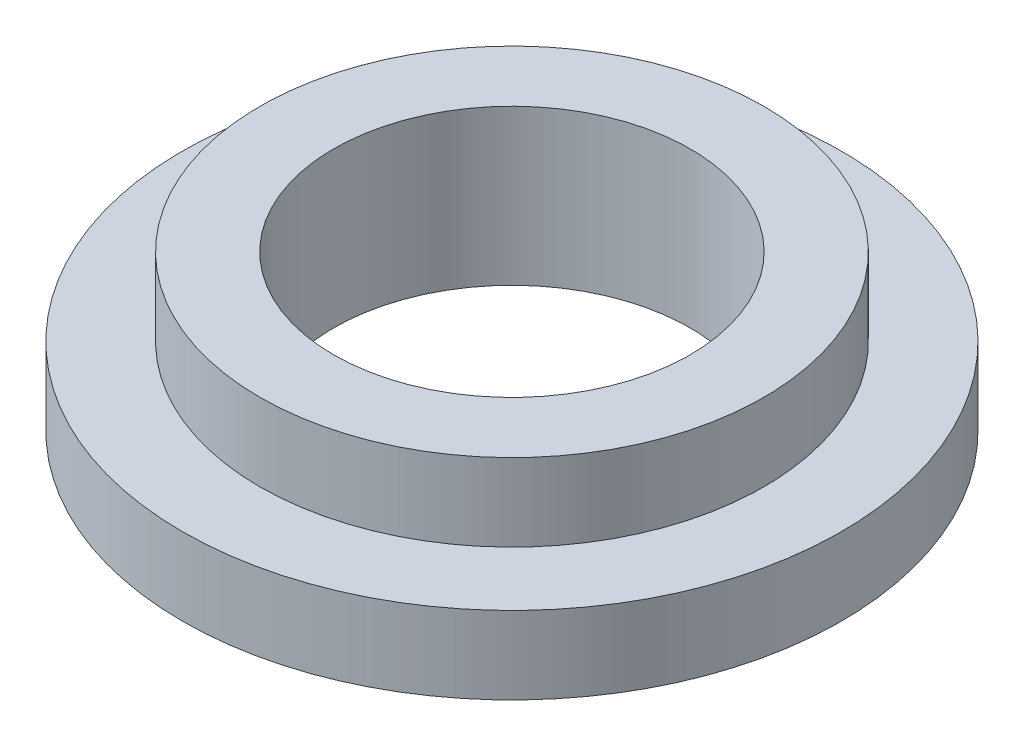
ISO-10303-21;
HEADER;
FILE_DESCRIPTION(('STEP AP214'),'2;1');
FILE_NAME('part.step','',(''),(''),'','','');
FILE_SCHEMA(('AUTOMOTIVE_DESIGN { 1 0 10303 214 1 1 1 1 }'));
ENDSEC;
DATA;
#1=APPLICATION_CONTEXT('core data for automotive mechanical design processes');
#2=APPLICATION_PROTOCOL_DEFINITION('international standard','automotive_design',2000,#1);
#3=PRODUCT_CONTEXT('',#1,'mechanical');
#4=PRODUCT('Part','Part','',(#3));
#5=PRODUCT_RELATED_PRODUCT_CATEGORY('part','',(#4));
#6=PRODUCT_DEFINITION_FORMATION('','',#4);
#7=PRODUCT_DEFINITION_CONTEXT('part definition',#1,'design');
#8=PRODUCT_DEFINITION('design','',#6,#7);
#9=PRODUCT_DEFINITION_SHAPE('','',#8);
#10=(LENGTH_UNIT() NAMED_UNIT(*) SI_UNIT(.MILLI.,.METRE.));
#11=(NAMED_UNIT(*) PLANE_ANGLE_UNIT() SI_UNIT($,.RADIAN.));
#12=(NAMED_UNIT(*) SI_UNIT($,.STERADIAN.) SOLID_ANGLE_UNIT());
#13=UNCERTAINTY_MEASURE_WITH_UNIT(LENGTH_MEASURE(1.E-05),#10,'distance_accuracy_value','');
#14=(GEOMETRIC_REPRESENTATION_CONTEXT(3) GLOBAL_UNCERTAINTY_ASSIGNED_CONTEXT((#13)) GLOBAL_UNIT_ASSIGNED_CONTEXT((#10,
#11,#12)) REPRESENTATION_CONTEXT('',''));
#15=CARTESIAN_POINT('',(0.,0.,0.));
#16=DIRECTION('',(0.,0.,1.));
#17=DIRECTION('',(1.,0.,0.));
#18=AXIS2_PLACEMENT_3D('',#15,#16,#17);
#19=CARTESIAN_POINT('',(0.,10.,0.));
#20=DIRECTION('',(0.,-1.,0.));
#21=DIRECTION('',(0.,0.,-1.));
#22=AXIS2_PLACEMENT_3D('',#19,#20,#21);
#23=CYLINDRICAL_SURFACE('',#22,42.5);
#24=CARTESIAN_POINT('',(0.,10.,0.));
#25=DIRECTION('',(0.,1.,0.));
#26=DIRECTION('',(0.,0.,1.));
#27=AXIS2_PLACEMENT_3D('',#24,#25,#26);
#28=CIRCLE('',#27,42.5);
#29=CARTESIAN_POINT('',(0.,10.,42.5));
#30=VERTEX_POINT('',#29);
#31=EDGE_CURVE('E51',#30,#30,#28,.T.);
#32=ORIENTED_EDGE('',*,*,#31,.F.);
#33=EDGE_LOOP('',(#32));
#34=FACE_BOUND('',#33,.T.);
#35=CARTESIAN_POINT('',(0.,0.,0.));
#36=DIRECTION('',(0.,1.,0.));
#37=DIRECTION('',(0.,0.,1.));
#38=AXIS2_PLACEMENT_3D('',#35,#36,#37);
#39=CIRCLE('',#38,42.5);
#40=CARTESIAN_POINT('',(0.,0.,42.5));
#41=VERTEX_POINT('',#40);
#42=EDGE_CURVE('E46',#41,#41,#39,.T.);
#43=ORIENTED_EDGE('',*,*,#42,.T.);
#44=EDGE_LOOP('',(#43));
#45=FACE_BOUND('',#44,.T.);
#46=ADVANCED_FACE('F43',(#34,#45),#23,.T.);
#47=CARTESIAN_POINT('',(0.,10.,0.));
#48=DIRECTION('',(0.,1.,0.));
#49=DIRECTION('',(0.,0.,1.));
#50=AXIS2_PLACEMENT_3D('',#47,#48,#49);
#51=PLANE('',#50);
#52=CARTESIAN_POINT('',(0.,10.,0.));
#53=DIRECTION('',(0.,1.,0.));
#54=DIRECTION('',(0.,0.,1.));
#55=AXIS2_PLACEMENT_3D('',#52,#53,#54);
#56=CIRCLE('',#55,32.5);
#57=CARTESIAN_POINT('',(0.,10.,32.5));
#58=VERTEX_POINT('',#57);
#59=EDGE_CURVE('E10',#58,#58,#56,.T.);
#60=ORIENTED_EDGE('',*,*,#59,.F.);
#61=EDGE_LOOP('',(#60));
#62=FACE_BOUND('',#61,.T.);
#63=ORIENTED_EDGE('',*,*,#31,.T.);
#64=EDGE_LOOP('',(#63));
#65=FACE_BOUND('',#64,.T.);
#66=ADVANCED_FACE('F93',(#62,#65),#51,.T.);
#67=CARTESIAN_POINT('',(0.,0.,0.));
#68=DIRECTION('',(0.,1.,0.));
#69=DIRECTION('',(0.,0.,1.));
#70=AXIS2_PLACEMENT_3D('',#67,#68,#69);
#71=PLANE('',#70);
#72=CARTESIAN_POINT('',(0.,0.,0.));
#73=DIRECTION('',(0.,1.,0.));
#74=DIRECTION('',(0.,0.,1.));
#75=AXIS2_PLACEMENT_3D('',#72,#73,#74);
#76=CIRCLE('',#75,23.);
#77=CARTESIAN_POINT('',(0.,0.,23.));
#78=VERTEX_POINT('',#77);
#79=EDGE_CURVE('E62',#78,#78,#76,.T.);
#80=ORIENTED_EDGE('',*,*,#79,.T.);
#81=EDGE_LOOP('',(#80));
#82=FACE_BOUND('',#81,.T.);
#83=ORIENTED_EDGE('',*,*,#42,.F.);
#84=EDGE_LOOP('',(#83));
#85=FACE_BOUND('',#84,.T.);
#86=ADVANCED_FACE('F71',(#82,#85),#71,.F.);
#87=CARTESIAN_POINT('',(0.,20.,0.));
#88=DIRECTION('',(0.,-1.,0.));
#89=DIRECTION('',(0.,0.,-1.));
#90=AXIS2_PLACEMENT_3D('',#87,#88,#89);
#91=CYLINDRICAL_SURFACE('',#90,32.5);
#92=CARTESIAN_POINT('',(0.,20.,0.));
#93=DIRECTION('',(0.,1.,0.));
#94=DIRECTION('',(0.,0.,1.));
#95=AXIS2_PLACEMENT_3D('',#92,#93,#94);
#96=CIRCLE('',#95,32.5);
#97=CARTESIAN_POINT('',(0.,20.,32.5));
#98=VERTEX_POINT('',#97);
#99=EDGE_CURVE('E58',#98,#98,#96,.T.);
#100=ORIENTED_EDGE('',*,*,#99,.F.);
#101=EDGE_LOOP('',(#100));
#102=FACE_BOUND('',#101,.T.);
#103=ORIENTED_EDGE('',*,*,#59,.T.);
#104=EDGE_LOOP('',(#103));
#105=FACE_BOUND('',#104,.T.);
#106=ADVANCED_FACE('F83',(#102,#105),#91,.T.);
#107=CARTESIAN_POINT('',(0.,20.,0.));
#108=DIRECTION('',(0.,1.,0.));
#109=DIRECTION('',(0.,0.,1.));
#110=AXIS2_PLACEMENT_3D('',#107,#108,#109);
#111=PLANE('',#110);
#112=CARTESIAN_POINT('',(0.,20.,0.));
#113=DIRECTION('',(0.,1.,0.));
#114=DIRECTION('',(0.,0.,1.));
#115=AXIS2_PLACEMENT_3D('',#112,#113,#114);
#116=CIRCLE('',#115,23.);
#117=CARTESIAN_POINT('',(0.,20.,23.));
#118=VERTEX_POINT('',#117);
#119=EDGE_CURVE('E63',#118,#118,#116,.T.);
#120=ORIENTED_EDGE('',*,*,#119,.F.);
#121=EDGE_LOOP('',(#120));
#122=FACE_BOUND('',#121,.T.);
#123=ORIENTED_EDGE('',*,*,#99,.T.);
#124=EDGE_LOOP('',(#123));
#125=FACE_BOUND('',#124,.T.);
#126=ADVANCED_FACE('F77',(#122,#125),#111,.T.);
#127=CARTESIAN_POINT('',(0.,0.,0.));
#128=DIRECTION('',(0.,1.,0.));
#129=DIRECTION('',(0.,0.,1.));
#130=AXIS2_PLACEMENT_3D('',#127,#128,#129);
#131=CYLINDRICAL_SURFACE('',#130,23.);
#132=ORIENTED_EDGE('',*,*,#79,.F.);
#133=EDGE_LOOP('',(#132));
#134=FACE_BOUND('',#133,.T.);
#135=ORIENTED_EDGE('',*,*,#119,.T.);
#136=EDGE_LOOP('',(#135));
#137=FACE_BOUND('',#136,.T.);
#138=ADVANCED_FACE('F74',(#134,#137),#131,.F.);
#139=CLOSED_SHELL('',(#46,#66,#86,#106,#126,#138));
#140=MANIFOLD_SOLID_BREP('B2',#139);
#141=ADVANCED_BREP_SHAPE_REPRESENTATION('',(#18,#140),#14);
#142=SHAPE_DEFINITION_REPRESENTATION(#9,#141);
ENDSEC;
END-ISO-10303-21;
